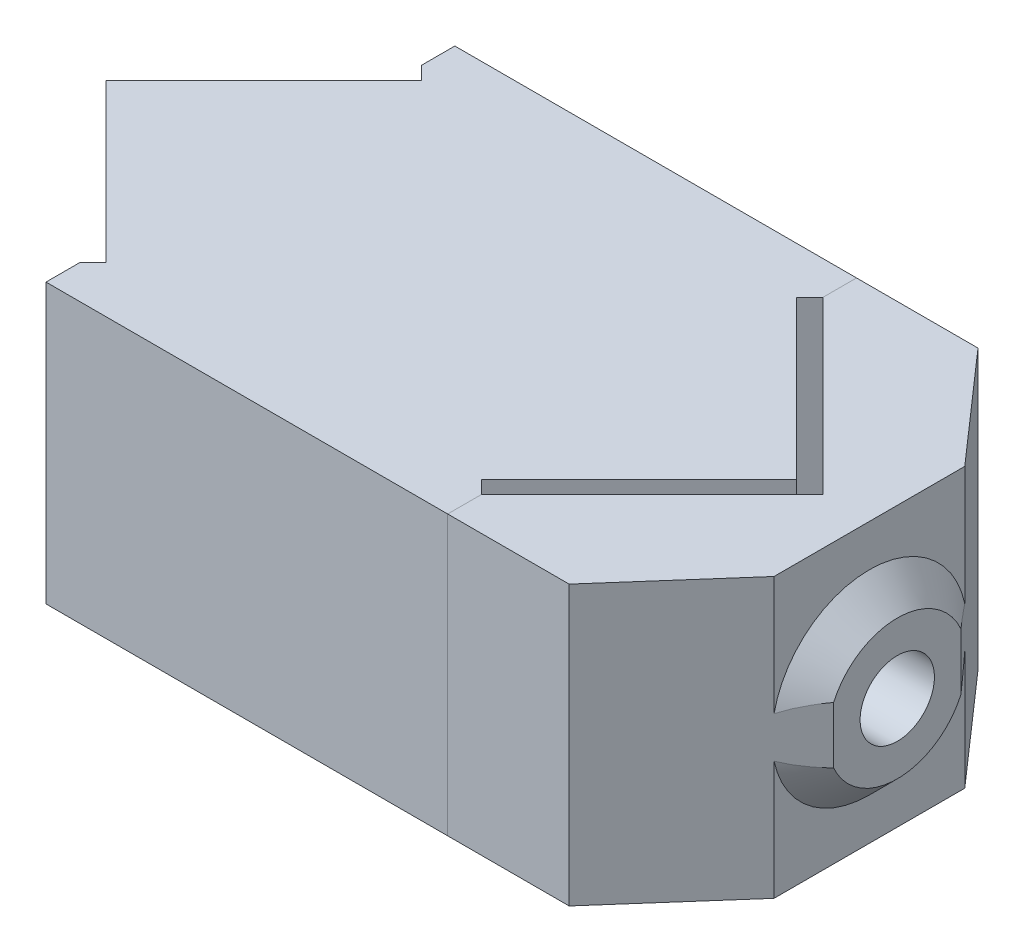
ISO-10303-21;
HEADER;
FILE_DESCRIPTION(('STEP AP214'),'2;1');
FILE_NAME('part.step','',(''),(''),'','','');
FILE_SCHEMA(('AUTOMOTIVE_DESIGN { 1 0 10303 214 1 1 1 1 }'));
ENDSEC;
DATA;
#1=APPLICATION_CONTEXT('core data for automotive mechanical design processes');
#2=APPLICATION_PROTOCOL_DEFINITION('international standard','automotive_design',2000,#1);
#3=PRODUCT_CONTEXT('',#1,'mechanical');
#4=PRODUCT('Part','Part','',(#3));
#5=PRODUCT_RELATED_PRODUCT_CATEGORY('part','',(#4));
#6=PRODUCT_DEFINITION_FORMATION('','',#4);
#7=PRODUCT_DEFINITION_CONTEXT('part definition',#1,'design');
#8=PRODUCT_DEFINITION('design','',#6,#7);
#9=PRODUCT_DEFINITION_SHAPE('','',#8);
#10=(LENGTH_UNIT() NAMED_UNIT(*) SI_UNIT(.MILLI.,.METRE.));
#11=(NAMED_UNIT(*) PLANE_ANGLE_UNIT() SI_UNIT($,.RADIAN.));
#12=(NAMED_UNIT(*) SI_UNIT($,.STERADIAN.) SOLID_ANGLE_UNIT());
#13=UNCERTAINTY_MEASURE_WITH_UNIT(LENGTH_MEASURE(1.E-05),#10,'distance_accuracy_value','');
#14=(GEOMETRIC_REPRESENTATION_CONTEXT(3) GLOBAL_UNCERTAINTY_ASSIGNED_CONTEXT((#13)) GLOBAL_UNIT_ASSIGNED_CONTEXT((#10,
#11,#12)) REPRESENTATION_CONTEXT('',''));
#15=CARTESIAN_POINT('',(0.,0.,0.));
#16=DIRECTION('',(0.,0.,1.));
#17=DIRECTION('',(1.,0.,0.));
#18=AXIS2_PLACEMENT_3D('',#15,#16,#17);
#19=CARTESIAN_POINT('',(48.,0.,0.));
#20=DIRECTION('',(-1.,0.,0.));
#21=DIRECTION('',(0.,0.,1.));
#22=AXIS2_PLACEMENT_3D('',#19,#20,#21);
#23=CONICAL_SURFACE('',#22,7.5,0.785398163397443);
#24=CARTESIAN_POINT('',(48.,0.,0.));
#25=DIRECTION('',(1.,0.,0.));
#26=DIRECTION('',(0.,0.,-1.));
#27=AXIS2_PLACEMENT_3D('',#24,#25,#26);
#28=CIRCLE('',#27,7.5);
#29=CARTESIAN_POINT('',(48.,3.05573928548819,-6.84926692567347));
#30=VERTEX_POINT('',#29);
#31=CARTESIAN_POINT('',(48.,3.05573928548819,6.84926692567347));
#32=VERTEX_POINT('',#31);
#33=EDGE_CURVE('E156',#30,#32,#28,.T.);
#34=ORIENTED_EDGE('',*,*,#33,.F.);
#35=CARTESIAN_POINT('',(48.9987726796251,0.,-5.71261644423293));
#36=DIRECTION('',(-0.751198318711611,0.,0.660076575834083));
#37=DIRECTION('',(-0.660076575834083,0.,-0.751198318711611));
#38=AXIS2_PLACEMENT_3D('',#35,#36,#37);
#39=ELLIPSE('',#38,8.65447533419048,3.10354153061785);
#40=CARTESIAN_POINT('',(45.,2.21640329996971,-10.2634086156541));
#41=VERTEX_POINT('',#40);
#42=EDGE_CURVE('E182',#41,#30,#39,.F.);
#43=ORIENTED_EDGE('',*,*,#42,.F.);
#44=CARTESIAN_POINT('',(45.,0.,0.));
#45=DIRECTION('',(-1.,0.,0.));
#46=DIRECTION('',(0.,0.,1.));
#47=AXIS2_PLACEMENT_3D('',#44,#45,#46);
#48=CIRCLE('',#47,10.5);
#49=CARTESIAN_POINT('',(45.,2.21640329996971,10.2634086156541));
#50=VERTEX_POINT('',#49);
#51=EDGE_CURVE('E174',#50,#41,#48,.T.);
#52=ORIENTED_EDGE('',*,*,#51,.F.);
#53=CARTESIAN_POINT('',(48.9987726796251,0.,5.71261644423293));
#54=DIRECTION('',(-0.751198318711611,0.,-0.660076575834083));
#55=DIRECTION('',(-0.660076575834083,0.,0.751198318711611));
#56=AXIS2_PLACEMENT_3D('',#53,#54,#55);
#57=ELLIPSE('',#56,8.65447533419048,3.10354153061785);
#58=EDGE_CURVE('E186',#32,#50,#57,.F.);
#59=ORIENTED_EDGE('',*,*,#58,.F.);
#60=EDGE_LOOP('',(#34,#43,#52,#59));
#61=FACE_BOUND('',#60,.T.);
#62=ADVANCED_FACE('F51',(#61),#23,.T.);
#63=CARTESIAN_POINT('',(45.,15.,-10.2634086156541));
#64=DIRECTION('',(-1.,0.,0.));
#65=DIRECTION('',(0.,0.,1.));
#66=AXIS2_PLACEMENT_3D('',#63,#64,#65);
#67=PLANE('',#66);
#68=DIRECTION('',(0.,-1.,0.));
#69=VECTOR('',#68,1.);
#70=CARTESIAN_POINT('',(45.,15.,10.2634086156541));
#71=LINE('',#70,#69);
#72=CARTESIAN_POINT('',(45.,15.,10.2634086156541));
#73=VERTEX_POINT('',#72);
#74=EDGE_CURVE('E218',#73,#50,#71,.T.);
#75=ORIENTED_EDGE('',*,*,#74,.T.);
#76=ORIENTED_EDGE('',*,*,#51,.T.);
#77=DIRECTION('',(0.,-1.,0.));
#78=VECTOR('',#77,1.);
#79=CARTESIAN_POINT('',(45.,15.,-10.2634086156541));
#80=LINE('',#79,#78);
#81=CARTESIAN_POINT('',(45.,15.,-10.2634086156541));
#82=VERTEX_POINT('',#81);
#83=EDGE_CURVE('E209',#82,#41,#80,.T.);
#84=ORIENTED_EDGE('',*,*,#83,.F.);
#85=DIRECTION('',(0.,0.,-1.));
#86=VECTOR('',#85,1.);
#87=CARTESIAN_POINT('',(45.,15.,-10.2634086156541));
#88=LINE('',#87,#86);
#89=EDGE_CURVE('E276',#73,#82,#88,.T.);
#90=ORIENTED_EDGE('',*,*,#89,.F.);
#91=EDGE_LOOP('',(#75,#76,#84,#90));
#92=FACE_BOUND('',#91,.T.);
#93=ADVANCED_FACE('F301',(#92),#67,.F.);
#94=CARTESIAN_POINT('',(40.,15.,0.));
#95=DIRECTION('',(0.707106781186544,0.,-0.707106781186551));
#96=DIRECTION('',(-0.707106781186551,0.,-0.707106781186544));
#97=AXIS2_PLACEMENT_3D('',#94,#95,#96);
#98=PLANE('',#97);
#99=DIRECTION('',(0.,-1.,0.));
#100=VECTOR('',#99,1.);
#101=CARTESIAN_POINT('',(40.,15.,0.));
#102=LINE('',#101,#100);
#103=CARTESIAN_POINT('',(40.,-4.,0.));
#104=VERTEX_POINT('',#103);
#105=CARTESIAN_POINT('',(40.,-15.,0.));
#106=VERTEX_POINT('',#105);
#107=EDGE_CURVE('E164',#104,#106,#102,.T.);
#108=ORIENTED_EDGE('',*,*,#107,.F.);
#109=CARTESIAN_POINT('',(40.,0.,0.));
#110=DIRECTION('',(0.707106781186544,0.,-0.707106781186551));
#111=DIRECTION('',(0.707106781186551,0.,0.707106781186544));
#112=AXIS2_PLACEMENT_3D('',#109,#110,#111);
#113=ELLIPSE('',#112,5.65685424949241,4.);
#114=CARTESIAN_POINT('',(40.,4.,0.));
#115=VERTEX_POINT('',#114);
#116=EDGE_CURVE('E152',#104,#115,#113,.T.);
#117=ORIENTED_EDGE('',*,*,#116,.T.);
#118=CARTESIAN_POINT('',(40.,15.,0.));
#119=VERTEX_POINT('',#118);
#120=EDGE_CURVE('E162',#119,#115,#102,.T.);
#121=ORIENTED_EDGE('',*,*,#120,.F.);
#122=DIRECTION('',(0.707106781186551,0.,0.707106781186544));
#123=VECTOR('',#122,1.);
#124=CARTESIAN_POINT('',(40.,15.,0.));
#125=LINE('',#124,#123);
#126=CARTESIAN_POINT('',(21.6152236891497,15.,-18.3847763108501));
#127=VERTEX_POINT('',#126);
#128=EDGE_CURVE('E256',#127,#119,#125,.T.);
#129=ORIENTED_EDGE('',*,*,#128,.F.);
#130=DIRECTION('',(0.,-1.,0.));
#131=VECTOR('',#130,1.);
#132=CARTESIAN_POINT('',(21.6152236891497,15.,-18.3847763108501));
#133=LINE('',#132,#131);
#134=CARTESIAN_POINT('',(21.6152236891497,-15.,-18.3847763108501));
#135=VERTEX_POINT('',#134);
#136=EDGE_CURVE('E257',#127,#135,#133,.T.);
#137=ORIENTED_EDGE('',*,*,#136,.T.);
#138=DIRECTION('',(0.707106781186551,0.,0.707106781186544));
#139=VECTOR('',#138,1.);
#140=CARTESIAN_POINT('',(40.,-15.,0.));
#141=LINE('',#140,#139);
#142=EDGE_CURVE('E165',#135,#106,#141,.T.);
#143=ORIENTED_EDGE('',*,*,#142,.T.);
#144=EDGE_LOOP('',(#108,#117,#121,#129,#137,#143));
#145=FACE_BOUND('',#144,.T.);
#146=ADVANCED_FACE('F160',(#145),#98,.F.);
#147=CARTESIAN_POINT('',(40.,15.,0.));
#148=DIRECTION('',(0.707106781186544,0.,0.707106781186551));
#149=DIRECTION('',(0.707106781186551,0.,-0.707106781186544));
#150=AXIS2_PLACEMENT_3D('',#147,#148,#149);
#151=PLANE('',#150);
#152=ORIENTED_EDGE('',*,*,#120,.T.);
#153=CARTESIAN_POINT('',(40.,0.,0.));
#154=DIRECTION('',(0.707106781186544,0.,0.707106781186551));
#155=DIRECTION('',(0.707106781186551,0.,-0.707106781186544));
#156=AXIS2_PLACEMENT_3D('',#153,#154,#155);
#157=ELLIPSE('',#156,5.65685424949241,4.);
#158=EDGE_CURVE('E148',#115,#104,#157,.T.);
#159=ORIENTED_EDGE('',*,*,#158,.T.);
#160=ORIENTED_EDGE('',*,*,#107,.T.);
#161=DIRECTION('',(-0.707106781186551,0.,0.707106781186544));
#162=VECTOR('',#161,1.);
#163=CARTESIAN_POINT('',(40.,-15.,0.));
#164=LINE('',#163,#162);
#165=CARTESIAN_POINT('',(21.6152236891497,-15.,18.3847763108501));
#166=VERTEX_POINT('',#165);
#167=EDGE_CURVE('E239',#106,#166,#164,.T.);
#168=ORIENTED_EDGE('',*,*,#167,.T.);
#169=DIRECTION('',(0.,-1.,0.));
#170=VECTOR('',#169,1.);
#171=CARTESIAN_POINT('',(21.6152236891497,15.,18.3847763108501));
#172=LINE('',#171,#170);
#173=CARTESIAN_POINT('',(21.6152236891497,15.,18.3847763108501));
#174=VERTEX_POINT('',#173);
#175=EDGE_CURVE('E176',#174,#166,#172,.T.);
#176=ORIENTED_EDGE('',*,*,#175,.F.);
#177=DIRECTION('',(-0.707106781186551,0.,0.707106781186544));
#178=VECTOR('',#177,1.);
#179=CARTESIAN_POINT('',(40.,15.,0.));
#180=LINE('',#179,#178);
#181=EDGE_CURVE('E169',#119,#174,#180,.T.);
#182=ORIENTED_EDGE('',*,*,#181,.F.);
#183=EDGE_LOOP('',(#152,#159,#160,#168,#176,#182));
#184=FACE_BOUND('',#183,.T.);
#185=ADVANCED_FACE('F167',(#184),#151,.F.);
#186=CARTESIAN_POINT('',(21.6152236891497,15.,18.3847763108501));
#187=DIRECTION('',(1.,0.,0.));
#188=DIRECTION('',(0.,0.,-1.));
#189=AXIS2_PLACEMENT_3D('',#186,#187,#188);
#190=PLANE('',#189);
#191=DIRECTION('',(0.,0.,1.));
#192=VECTOR('',#191,1.);
#193=CARTESIAN_POINT('',(21.6152236891497,-15.,18.3847763108501));
#194=LINE('',#193,#192);
#195=CARTESIAN_POINT('',(21.6152236891497,-15.,22.));
#196=VERTEX_POINT('',#195);
#197=EDGE_CURVE('E233',#166,#196,#194,.T.);
#198=ORIENTED_EDGE('',*,*,#197,.T.);
#199=DIRECTION('',(0.,-1.,0.));
#200=VECTOR('',#199,1.);
#201=CARTESIAN_POINT('',(21.6152236891497,15.,22.));
#202=LINE('',#201,#200);
#203=CARTESIAN_POINT('',(21.6152236891497,15.,22.));
#204=VERTEX_POINT('',#203);
#205=EDGE_CURVE('E222',#204,#196,#202,.T.);
#206=ORIENTED_EDGE('',*,*,#205,.F.);
#207=DIRECTION('',(0.,0.,1.));
#208=VECTOR('',#207,1.);
#209=CARTESIAN_POINT('',(21.6152236891497,15.,18.3847763108501));
#210=LINE('',#209,#208);
#211=EDGE_CURVE('E234',#174,#204,#210,.T.);
#212=ORIENTED_EDGE('',*,*,#211,.F.);
#213=ORIENTED_EDGE('',*,*,#175,.T.);
#214=EDGE_LOOP('',(#198,#206,#212,#213));
#215=FACE_BOUND('',#214,.T.);
#216=ADVANCED_FACE('F232',(#215),#190,.F.);
#217=CARTESIAN_POINT('',(21.6152236891497,15.,22.));
#218=DIRECTION('',(0.,0.,-1.));
#219=DIRECTION('',(-1.,0.,0.));
#220=AXIS2_PLACEMENT_3D('',#217,#218,#219);
#221=PLANE('',#220);
#222=DIRECTION('',(1.,0.,0.));
#223=VECTOR('',#222,1.);
#224=CARTESIAN_POINT('',(21.6152236891497,-15.,22.));
#225=LINE('',#224,#223);
#226=CARTESIAN_POINT('',(34.6870788179746,-15.,22.));
#227=VERTEX_POINT('',#226);
#228=EDGE_CURVE('E241',#196,#227,#225,.T.);
#229=ORIENTED_EDGE('',*,*,#228,.T.);
#230=DIRECTION('',(0.,-1.,0.));
#231=VECTOR('',#230,1.);
#232=CARTESIAN_POINT('',(34.6870788179746,15.,22.));
#233=LINE('',#232,#231);
#234=CARTESIAN_POINT('',(34.6870788179746,15.,22.));
#235=VERTEX_POINT('',#234);
#236=EDGE_CURVE('E220',#235,#227,#233,.T.);
#237=ORIENTED_EDGE('',*,*,#236,.F.);
#238=DIRECTION('',(1.,0.,0.));
#239=VECTOR('',#238,1.);
#240=CARTESIAN_POINT('',(21.6152236891497,15.,22.));
#241=LINE('',#240,#239);
#242=EDGE_CURVE('E280',#204,#235,#241,.T.);
#243=ORIENTED_EDGE('',*,*,#242,.F.);
#244=ORIENTED_EDGE('',*,*,#205,.T.);
#245=EDGE_LOOP('',(#229,#237,#243,#244));
#246=FACE_BOUND('',#245,.T.);
#247=ADVANCED_FACE('F370',(#246),#221,.F.);
#248=CARTESIAN_POINT('',(34.6870788179746,15.,22.));
#249=DIRECTION('',(-0.751198318711611,0.,-0.660076575834083));
#250=DIRECTION('',(-0.660076575834083,0.,0.751198318711611));
#251=AXIS2_PLACEMENT_3D('',#248,#249,#250);
#252=PLANE('',#251);
#253=DIRECTION('',(0.,-1.,0.));
#254=VECTOR('',#253,1.);
#255=CARTESIAN_POINT('',(48.,15.,6.84926692567347));
#256=LINE('',#255,#254);
#257=CARTESIAN_POINT('',(48.,-3.05573928548819,6.84926692567347));
#258=VERTEX_POINT('',#257);
#259=EDGE_CURVE('E12',#32,#258,#256,.T.);
#260=ORIENTED_EDGE('',*,*,#259,.F.);
#261=ORIENTED_EDGE('',*,*,#58,.T.);
#262=ORIENTED_EDGE('',*,*,#74,.F.);
#263=DIRECTION('',(0.660076575834083,0.,-0.751198318711611));
#264=VECTOR('',#263,1.);
#265=CARTESIAN_POINT('',(34.6870788179746,15.,22.));
#266=LINE('',#265,#264);
#267=EDGE_CURVE('E278',#235,#73,#266,.T.);
#268=ORIENTED_EDGE('',*,*,#267,.F.);
#269=ORIENTED_EDGE('',*,*,#236,.T.);
#270=DIRECTION('',(0.660076575834083,0.,-0.751198318711611));
#271=VECTOR('',#270,1.);
#272=CARTESIAN_POINT('',(34.6870788179746,-15.,22.));
#273=LINE('',#272,#271);
#274=CARTESIAN_POINT('',(45.,-15.,10.2634086156541));
#275=VERTEX_POINT('',#274);
#276=EDGE_CURVE('E243',#227,#275,#273,.T.);
#277=ORIENTED_EDGE('',*,*,#276,.T.);
#278=CARTESIAN_POINT('',(45.,-2.21640329996971,10.2634086156541));
#279=VERTEX_POINT('',#278);
#280=EDGE_CURVE('E195',#279,#275,#71,.T.);
#281=ORIENTED_EDGE('',*,*,#280,.F.);
#282=EDGE_CURVE('E185',#279,#258,#57,.F.);
#283=ORIENTED_EDGE('',*,*,#282,.T.);
#284=EDGE_LOOP('',(#260,#261,#262,#268,#269,#277,#281,#283));
#285=FACE_BOUND('',#284,.T.);
#286=ADVANCED_FACE('F193',(#285),#252,.F.);
#287=CARTESIAN_POINT('',(45.,-2.21640329996971,-10.2634086156541));
#288=VERTEX_POINT('',#287);
#289=CARTESIAN_POINT('',(45.,-15.,-10.2634086156541));
#290=VERTEX_POINT('',#289);
#291=EDGE_CURVE('E205',#288,#290,#80,.T.);
#292=ORIENTED_EDGE('',*,*,#291,.F.);
#293=CARTESIAN_POINT('',(45.,0.,0.));
#294=DIRECTION('',(-1.,0.,0.));
#295=DIRECTION('',(0.,0.,1.));
#296=AXIS2_PLACEMENT_3D('',#293,#294,#295);
#297=CIRCLE('',#296,10.5);
#298=EDGE_CURVE('E171',#288,#279,#297,.T.);
#299=ORIENTED_EDGE('',*,*,#298,.T.);
#300=ORIENTED_EDGE('',*,*,#280,.T.);
#301=DIRECTION('',(0.,0.,-1.));
#302=VECTOR('',#301,1.);
#303=CARTESIAN_POINT('',(45.,-15.,-10.2634086156541));
#304=LINE('',#303,#302);
#305=EDGE_CURVE('E207',#275,#290,#304,.T.);
#306=ORIENTED_EDGE('',*,*,#305,.T.);
#307=EDGE_LOOP('',(#292,#299,#300,#306));
#308=FACE_BOUND('',#307,.T.);
#309=ADVANCED_FACE('F203',(#308),#67,.F.);
#310=CARTESIAN_POINT('',(34.6870788179746,15.,-22.));
#311=DIRECTION('',(-0.751198318711611,0.,0.660076575834083));
#312=DIRECTION('',(0.660076575834083,0.,0.751198318711611));
#313=AXIS2_PLACEMENT_3D('',#310,#311,#312);
#314=PLANE('',#313);
#315=DIRECTION('',(0.,1.,0.));
#316=VECTOR('',#315,1.);
#317=CARTESIAN_POINT('',(48.,15.,-6.84926692567347));
#318=LINE('',#317,#316);
#319=CARTESIAN_POINT('',(48.,-3.05573928548819,-6.84926692567347));
#320=VERTEX_POINT('',#319);
#321=EDGE_CURVE('E60',#320,#30,#318,.T.);
#322=ORIENTED_EDGE('',*,*,#321,.F.);
#323=EDGE_CURVE('E183',#320,#288,#39,.F.);
#324=ORIENTED_EDGE('',*,*,#323,.T.);
#325=ORIENTED_EDGE('',*,*,#291,.T.);
#326=DIRECTION('',(-0.660076575834083,0.,-0.751198318711611));
#327=VECTOR('',#326,1.);
#328=CARTESIAN_POINT('',(34.6870788179746,-15.,-22.));
#329=LINE('',#328,#327);
#330=CARTESIAN_POINT('',(34.6870788179746,-15.,-22.));
#331=VERTEX_POINT('',#330);
#332=EDGE_CURVE('E250',#290,#331,#329,.T.);
#333=ORIENTED_EDGE('',*,*,#332,.T.);
#334=DIRECTION('',(0.,-1.,0.));
#335=VECTOR('',#334,1.);
#336=CARTESIAN_POINT('',(34.6870788179746,15.,-22.));
#337=LINE('',#336,#335);
#338=CARTESIAN_POINT('',(34.6870788179746,15.,-22.));
#339=VERTEX_POINT('',#338);
#340=EDGE_CURVE('E210',#339,#331,#337,.T.);
#341=ORIENTED_EDGE('',*,*,#340,.F.);
#342=DIRECTION('',(-0.660076575834083,0.,-0.751198318711611));
#343=VECTOR('',#342,1.);
#344=CARTESIAN_POINT('',(34.6870788179746,15.,-22.));
#345=LINE('',#344,#343);
#346=EDGE_CURVE('E274',#82,#339,#345,.T.);
#347=ORIENTED_EDGE('',*,*,#346,.F.);
#348=ORIENTED_EDGE('',*,*,#83,.T.);
#349=ORIENTED_EDGE('',*,*,#42,.T.);
#350=EDGE_LOOP('',(#322,#324,#325,#333,#341,#347,#348,#349));
#351=FACE_BOUND('',#350,.T.);
#352=ADVANCED_FACE('F291',(#351),#314,.F.);
#353=CARTESIAN_POINT('',(21.6152236891497,15.,-22.));
#354=DIRECTION('',(0.,0.,1.));
#355=DIRECTION('',(1.,0.,0.));
#356=AXIS2_PLACEMENT_3D('',#353,#354,#355);
#357=PLANE('',#356);
#358=DIRECTION('',(-1.,0.,0.));
#359=VECTOR('',#358,1.);
#360=CARTESIAN_POINT('',(21.6152236891497,-15.,-22.));
#361=LINE('',#360,#359);
#362=CARTESIAN_POINT('',(21.6152236891497,-15.,-22.));
#363=VERTEX_POINT('',#362);
#364=EDGE_CURVE('E252',#331,#363,#361,.T.);
#365=ORIENTED_EDGE('',*,*,#364,.T.);
#366=DIRECTION('',(0.,-1.,0.));
#367=VECTOR('',#366,1.);
#368=CARTESIAN_POINT('',(21.6152236891497,15.,-22.));
#369=LINE('',#368,#367);
#370=CARTESIAN_POINT('',(21.6152236891497,15.,-22.));
#371=VERTEX_POINT('',#370);
#372=EDGE_CURVE('E214',#371,#363,#369,.T.);
#373=ORIENTED_EDGE('',*,*,#372,.F.);
#374=DIRECTION('',(-1.,0.,0.));
#375=VECTOR('',#374,1.);
#376=CARTESIAN_POINT('',(21.6152236891497,15.,-22.));
#377=LINE('',#376,#375);
#378=EDGE_CURVE('E272',#339,#371,#377,.T.);
#379=ORIENTED_EDGE('',*,*,#378,.F.);
#380=ORIENTED_EDGE('',*,*,#340,.T.);
#381=EDGE_LOOP('',(#365,#373,#379,#380));
#382=FACE_BOUND('',#381,.T.);
#383=ADVANCED_FACE('F293',(#382),#357,.F.);
#384=CARTESIAN_POINT('',(21.6152236891497,15.,-18.3847763108501));
#385=DIRECTION('',(1.,0.,0.));
#386=DIRECTION('',(0.,0.,-1.));
#387=AXIS2_PLACEMENT_3D('',#384,#385,#386);
#388=PLANE('',#387);
#389=DIRECTION('',(0.,0.,1.));
#390=VECTOR('',#389,1.);
#391=CARTESIAN_POINT('',(21.6152236891497,-15.,-18.3847763108501));
#392=LINE('',#391,#390);
#393=EDGE_CURVE('E254',#363,#135,#392,.T.);
#394=ORIENTED_EDGE('',*,*,#393,.T.);
#395=ORIENTED_EDGE('',*,*,#136,.F.);
#396=DIRECTION('',(0.,0.,1.));
#397=VECTOR('',#396,1.);
#398=CARTESIAN_POINT('',(21.6152236891497,15.,-18.3847763108501));
#399=LINE('',#398,#397);
#400=EDGE_CURVE('E259',#371,#127,#399,.T.);
#401=ORIENTED_EDGE('',*,*,#400,.F.);
#402=ORIENTED_EDGE('',*,*,#372,.T.);
#403=EDGE_LOOP('',(#394,#395,#401,#402));
#404=FACE_BOUND('',#403,.T.);
#405=ADVANCED_FACE('F265',(#404),#388,.F.);
#406=CARTESIAN_POINT('',(0.,15.,0.));
#407=DIRECTION('',(0.,1.,0.));
#408=DIRECTION('',(0.,0.,1.));
#409=AXIS2_PLACEMENT_3D('',#406,#407,#408);
#410=PLANE('',#409);
#411=ORIENTED_EDGE('',*,*,#128,.T.);
#412=ORIENTED_EDGE('',*,*,#181,.T.);
#413=ORIENTED_EDGE('',*,*,#211,.T.);
#414=ORIENTED_EDGE('',*,*,#242,.T.);
#415=ORIENTED_EDGE('',*,*,#267,.T.);
#416=ORIENTED_EDGE('',*,*,#89,.T.);
#417=ORIENTED_EDGE('',*,*,#346,.T.);
#418=ORIENTED_EDGE('',*,*,#378,.T.);
#419=ORIENTED_EDGE('',*,*,#400,.T.);
#420=EDGE_LOOP('',(#411,#412,#413,#414,#415,#416,#417,#418,#419));
#421=FACE_BOUND('',#420,.T.);
#422=ADVANCED_FACE('F319',(#421),#410,.T.);
#423=CARTESIAN_POINT('',(0.,-15.,0.));
#424=DIRECTION('',(0.,1.,0.));
#425=DIRECTION('',(0.,0.,1.));
#426=AXIS2_PLACEMENT_3D('',#423,#424,#425);
#427=PLANE('',#426);
#428=ORIENTED_EDGE('',*,*,#142,.F.);
#429=ORIENTED_EDGE('',*,*,#393,.F.);
#430=ORIENTED_EDGE('',*,*,#364,.F.);
#431=ORIENTED_EDGE('',*,*,#332,.F.);
#432=ORIENTED_EDGE('',*,*,#305,.F.);
#433=ORIENTED_EDGE('',*,*,#276,.F.);
#434=ORIENTED_EDGE('',*,*,#228,.F.);
#435=ORIENTED_EDGE('',*,*,#197,.F.);
#436=ORIENTED_EDGE('',*,*,#167,.F.);
#437=EDGE_LOOP('',(#428,#429,#430,#431,#432,#433,#434,#435,#436));
#438=FACE_BOUND('',#437,.T.);
#439=ADVANCED_FACE('F238',(#438),#427,.F.);
#440=CARTESIAN_POINT('',(-37.1715728752538,0.,0.));
#441=DIRECTION('',(1.,0.,0.));
#442=DIRECTION('',(0.,0.,-1.));
#443=AXIS2_PLACEMENT_3D('',#440,#441,#442);
#444=CYLINDRICAL_SURFACE('',#443,4.);
#445=ORIENTED_EDGE('',*,*,#158,.F.);
#446=ORIENTED_EDGE('',*,*,#116,.F.);
#447=EDGE_LOOP('',(#445,#446));
#448=FACE_BOUND('',#447,.T.);
#449=CARTESIAN_POINT('',(48.,0.,0.));
#450=DIRECTION('',(1.,0.,0.));
#451=DIRECTION('',(0.,0.,-1.));
#452=AXIS2_PLACEMENT_3D('',#449,#450,#451);
#453=CIRCLE('',#452,4.);
#454=CARTESIAN_POINT('',(48.,0.,-4.));
#455=VERTEX_POINT('',#454);
#456=EDGE_CURVE('E286',#455,#455,#453,.T.);
#457=ORIENTED_EDGE('',*,*,#456,.T.);
#458=EDGE_LOOP('',(#457));
#459=FACE_BOUND('',#458,.T.);
#460=ADVANCED_FACE('F150',(#448,#459),#444,.F.);
#461=CARTESIAN_POINT('',(48.,0.,0.));
#462=DIRECTION('',(1.,0.,0.));
#463=DIRECTION('',(0.,0.,-1.));
#464=AXIS2_PLACEMENT_3D('',#461,#462,#463);
#465=PLANE('',#464);
#466=ORIENTED_EDGE('',*,*,#33,.T.);
#467=ORIENTED_EDGE('',*,*,#259,.T.);
#468=EDGE_CURVE('E200',#258,#320,#28,.T.);
#469=ORIENTED_EDGE('',*,*,#468,.T.);
#470=ORIENTED_EDGE('',*,*,#321,.T.);
#471=EDGE_LOOP('',(#466,#467,#469,#470));
#472=FACE_BOUND('',#471,.T.);
#473=ORIENTED_EDGE('',*,*,#456,.F.);
#474=EDGE_LOOP('',(#473));
#475=FACE_BOUND('',#474,.T.);
#476=ADVANCED_FACE('F289',(#472,#475),#465,.T.);
#477=ORIENTED_EDGE('',*,*,#323,.F.);
#478=ORIENTED_EDGE('',*,*,#468,.F.);
#479=ORIENTED_EDGE('',*,*,#282,.F.);
#480=ORIENTED_EDGE('',*,*,#298,.F.);
#481=EDGE_LOOP('',(#477,#478,#479,#480));
#482=FACE_BOUND('',#481,.T.);
#483=ADVANCED_FACE('F54',(#482),#23,.T.);
#484=CLOSED_SHELL('',(#62,#93,#146,#185,#216,#247,#286,#309,#352,#383,#405,#422,#439,#460,#476,#483));
#485=MANIFOLD_SOLID_BREP('B2',#484);
#486=CARTESIAN_POINT('',(37.1715728752538,15.,0.));
#487=DIRECTION('',(-0.707106781186544,0.,-0.707106781186551));
#488=DIRECTION('',(-0.707106781186551,0.,0.707106781186544));
#489=AXIS2_PLACEMENT_3D('',#486,#487,#488);
#490=PLANE('',#489);
#491=DIRECTION('',(0.,-1.,0.));
#492=VECTOR('',#491,1.);
#493=CARTESIAN_POINT('',(37.1715728752538,15.,0.));
#494=LINE('',#493,#492);
#495=CARTESIAN_POINT('',(37.1715728752538,-4.,0.));
#496=VERTEX_POINT('',#495);
#497=CARTESIAN_POINT('',(37.1715728752538,-15.,0.));
#498=VERTEX_POINT('',#497);
#499=EDGE_CURVE('E586',#496,#498,#494,.T.);
#500=ORIENTED_EDGE('',*,*,#499,.F.);
#501=CARTESIAN_POINT('',(37.1715728752538,0.,0.));
#502=DIRECTION('',(-0.707106781186544,0.,-0.707106781186551));
#503=DIRECTION('',(0.707106781186551,0.,-0.707106781186544));
#504=AXIS2_PLACEMENT_3D('',#501,#502,#503);
#505=ELLIPSE('',#504,5.65685424949241,4.);
#506=CARTESIAN_POINT('',(37.1715728752538,4.,0.));
#507=VERTEX_POINT('',#506);
#508=EDGE_CURVE('E452',#496,#507,#505,.T.);
#509=ORIENTED_EDGE('',*,*,#508,.T.);
#510=CARTESIAN_POINT('',(37.1715728752538,15.,0.));
#511=VERTEX_POINT('',#510);
#512=EDGE_CURVE('E446',#511,#507,#494,.T.);
#513=ORIENTED_EDGE('',*,*,#512,.F.);
#514=DIRECTION('',(0.707106781186551,0.,-0.707106781186544));
#515=VECTOR('',#514,1.);
#516=CARTESIAN_POINT('',(37.1715728752538,15.,0.));
#517=LINE('',#516,#515);
#518=CARTESIAN_POINT('',(20.2010101267766,15.,16.970562748477));
#519=VERTEX_POINT('',#518);
#520=EDGE_CURVE('E641',#519,#511,#517,.T.);
#521=ORIENTED_EDGE('',*,*,#520,.F.);
#522=DIRECTION('',(0.,-1.,0.));
#523=VECTOR('',#522,1.);
#524=CARTESIAN_POINT('',(20.2010101267766,15.,16.970562748477));
#525=LINE('',#524,#523);
#526=CARTESIAN_POINT('',(20.2010101267766,-15.,16.970562748477));
#527=VERTEX_POINT('',#526);
#528=EDGE_CURVE('E609',#519,#527,#525,.T.);
#529=ORIENTED_EDGE('',*,*,#528,.T.);
#530=DIRECTION('',(0.707106781186551,0.,-0.707106781186544));
#531=VECTOR('',#530,1.);
#532=CARTESIAN_POINT('',(37.1715728752538,-15.,0.));
#533=LINE('',#532,#531);
#534=EDGE_CURVE('E602',#527,#498,#533,.T.);
#535=ORIENTED_EDGE('',*,*,#534,.T.);
#536=EDGE_LOOP('',(#500,#509,#513,#521,#529,#535));
#537=FACE_BOUND('',#536,.T.);
#538=ADVANCED_FACE('F439',(#537),#490,.F.);
#539=CARTESIAN_POINT('',(37.1715728752538,15.,0.));
#540=DIRECTION('',(-0.707106781186544,0.,0.707106781186551));
#541=DIRECTION('',(0.707106781186551,0.,0.707106781186544));
#542=AXIS2_PLACEMENT_3D('',#539,#540,#541);
#543=PLANE('',#542);
#544=ORIENTED_EDGE('',*,*,#512,.T.);
#545=CARTESIAN_POINT('',(37.1715728752538,0.,0.));
#546=DIRECTION('',(-0.707106781186544,0.,0.707106781186551));
#547=DIRECTION('',(0.707106781186551,0.,0.707106781186544));
#548=AXIS2_PLACEMENT_3D('',#545,#546,#547);
#549=ELLIPSE('',#548,5.65685424949241,4.);
#550=EDGE_CURVE('E559',#507,#496,#549,.T.);
#551=ORIENTED_EDGE('',*,*,#550,.T.);
#552=ORIENTED_EDGE('',*,*,#499,.T.);
#553=DIRECTION('',(-0.707106781186551,0.,-0.707106781186544));
#554=VECTOR('',#553,1.);
#555=CARTESIAN_POINT('',(37.1715728752538,-15.,0.));
#556=LINE('',#555,#554);
#557=CARTESIAN_POINT('',(20.2010101267766,-15.,-16.970562748477));
#558=VERTEX_POINT('',#557);
#559=EDGE_CURVE('E594',#498,#558,#556,.T.);
#560=ORIENTED_EDGE('',*,*,#559,.T.);
#561=DIRECTION('',(0.,-1.,0.));
#562=VECTOR('',#561,1.);
#563=CARTESIAN_POINT('',(20.2010101267766,15.,-16.970562748477));
#564=LINE('',#563,#562);
#565=CARTESIAN_POINT('',(20.2010101267766,15.,-16.970562748477));
#566=VERTEX_POINT('',#565);
#567=EDGE_CURVE('E584',#566,#558,#564,.T.);
#568=ORIENTED_EDGE('',*,*,#567,.F.);
#569=DIRECTION('',(-0.707106781186551,0.,-0.707106781186544));
#570=VECTOR('',#569,1.);
#571=CARTESIAN_POINT('',(37.1715728752538,15.,0.));
#572=LINE('',#571,#570);
#573=EDGE_CURVE('E694',#511,#566,#572,.T.);
#574=ORIENTED_EDGE('',*,*,#573,.F.);
#575=EDGE_LOOP('',(#544,#551,#552,#560,#568,#574));
#576=FACE_BOUND('',#575,.T.);
#577=ADVANCED_FACE('F592',(#576),#543,.F.);
#578=CARTESIAN_POINT('',(20.2010101267766,15.,-16.970562748477));
#579=DIRECTION('',(-0.707106781186551,0.,-0.707106781186544));
#580=DIRECTION('',(-0.707106781186544,0.,0.707106781186551));
#581=AXIS2_PLACEMENT_3D('',#578,#579,#580);
#582=PLANE('',#581);
#583=DIRECTION('',(0.707106781186544,0.,-0.707106781186551));
#584=VECTOR('',#583,1.);
#585=CARTESIAN_POINT('',(20.2010101267766,-15.,-16.970562748477));
#586=LINE('',#585,#584);
#587=CARTESIAN_POINT('',(21.6152236891497,-15.,-18.3847763108501));
#588=VERTEX_POINT('',#587);
#589=EDGE_CURVE('E604',#558,#588,#586,.T.);
#590=ORIENTED_EDGE('',*,*,#589,.T.);
#591=DIRECTION('',(0.,-1.,0.));
#592=VECTOR('',#591,1.);
#593=CARTESIAN_POINT('',(21.6152236891497,15.,-18.3847763108501));
#594=LINE('',#593,#592);
#595=CARTESIAN_POINT('',(21.6152236891497,15.,-18.3847763108501));
#596=VERTEX_POINT('',#595);
#597=EDGE_CURVE('E581',#596,#588,#594,.T.);
#598=ORIENTED_EDGE('',*,*,#597,.F.);
#599=DIRECTION('',(0.707106781186544,0.,-0.707106781186551));
#600=VECTOR('',#599,1.);
#601=CARTESIAN_POINT('',(20.2010101267766,15.,-16.970562748477));
#602=LINE('',#601,#600);
#603=EDGE_CURVE('E692',#566,#596,#602,.T.);
#604=ORIENTED_EDGE('',*,*,#603,.F.);
#605=ORIENTED_EDGE('',*,*,#567,.T.);
#606=EDGE_LOOP('',(#590,#598,#604,#605));
#607=FACE_BOUND('',#606,.T.);
#608=ADVANCED_FACE('F717',(#607),#582,.F.);
#609=CARTESIAN_POINT('',(21.6152236891497,15.,-18.3847763108501));
#610=DIRECTION('',(-1.,0.,0.));
#611=DIRECTION('',(0.,0.,1.));
#612=AXIS2_PLACEMENT_3D('',#609,#610,#611);
#613=PLANE('',#612);
#614=DIRECTION('',(0.,0.,-1.));
#615=VECTOR('',#614,1.);
#616=CARTESIAN_POINT('',(21.6152236891497,-15.,-18.3847763108501));
#617=LINE('',#616,#615);
#618=CARTESIAN_POINT('',(21.6152236891497,-15.,-22.));
#619=VERTEX_POINT('',#618);
#620=EDGE_CURVE('E617',#588,#619,#617,.T.);
#621=ORIENTED_EDGE('',*,*,#620,.T.);
#622=DIRECTION('',(0.,-1.,0.));
#623=VECTOR('',#622,1.);
#624=CARTESIAN_POINT('',(21.6152236891497,15.,-22.));
#625=LINE('',#624,#623);
#626=CARTESIAN_POINT('',(21.6152236891497,15.,-22.));
#627=VERTEX_POINT('',#626);
#628=EDGE_CURVE('E578',#627,#619,#625,.T.);
#629=ORIENTED_EDGE('',*,*,#628,.F.);
#630=DIRECTION('',(0.,0.,-1.));
#631=VECTOR('',#630,1.);
#632=CARTESIAN_POINT('',(21.6152236891497,15.,-18.3847763108501));
#633=LINE('',#632,#631);
#634=EDGE_CURVE('E690',#596,#627,#633,.T.);
#635=ORIENTED_EDGE('',*,*,#634,.F.);
#636=ORIENTED_EDGE('',*,*,#597,.T.);
#637=EDGE_LOOP('',(#621,#629,#635,#636));
#638=FACE_BOUND('',#637,.T.);
#639=ADVANCED_FACE('F721',(#638),#613,.F.);
#640=CARTESIAN_POINT('',(-21.6152236891497,15.,-22.));
#641=DIRECTION('',(0.,0.,1.));
#642=DIRECTION('',(1.,0.,0.));
#643=AXIS2_PLACEMENT_3D('',#640,#641,#642);
#644=PLANE('',#643);
#645=DIRECTION('',(-1.,0.,0.));
#646=VECTOR('',#645,1.);
#647=CARTESIAN_POINT('',(-21.6152236891497,-15.,-22.));
#648=LINE('',#647,#646);
#649=CARTESIAN_POINT('',(-21.6152236891497,-15.,-22.));
#650=VERTEX_POINT('',#649);
#651=EDGE_CURVE('E620',#619,#650,#648,.T.);
#652=ORIENTED_EDGE('',*,*,#651,.T.);
#653=DIRECTION('',(0.,-1.,0.));
#654=VECTOR('',#653,1.);
#655=CARTESIAN_POINT('',(-21.6152236891497,15.,-22.));
#656=LINE('',#655,#654);
#657=CARTESIAN_POINT('',(-21.6152236891497,15.,-22.));
#658=VERTEX_POINT('',#657);
#659=EDGE_CURVE('E575',#658,#650,#656,.T.);
#660=ORIENTED_EDGE('',*,*,#659,.F.);
#661=DIRECTION('',(-1.,0.,0.));
#662=VECTOR('',#661,1.);
#663=CARTESIAN_POINT('',(21.6152236891497,15.,-22.));
#664=LINE('',#663,#662);
#665=EDGE_CURVE('E688',#627,#658,#664,.T.);
#666=ORIENTED_EDGE('',*,*,#665,.F.);
#667=ORIENTED_EDGE('',*,*,#628,.T.);
#668=EDGE_LOOP('',(#652,#660,#666,#667));
#669=FACE_BOUND('',#668,.T.);
#670=ADVANCED_FACE('F727',(#669),#644,.F.);
#671=CARTESIAN_POINT('',(-21.6152236891497,15.,-18.3847763108501));
#672=DIRECTION('',(1.,0.,0.));
#673=DIRECTION('',(0.,0.,-1.));
#674=AXIS2_PLACEMENT_3D('',#671,#672,#673);
#675=PLANE('',#674);
#676=DIRECTION('',(0.,0.,1.));
#677=VECTOR('',#676,1.);
#678=CARTESIAN_POINT('',(-21.6152236891497,-15.,-18.3847763108501));
#679=LINE('',#678,#677);
#680=CARTESIAN_POINT('',(-21.6152236891497,-15.,-18.3847763108501));
#681=VERTEX_POINT('',#680);
#682=EDGE_CURVE('E622',#650,#681,#679,.T.);
#683=ORIENTED_EDGE('',*,*,#682,.T.);
#684=DIRECTION('',(0.,-1.,0.));
#685=VECTOR('',#684,1.);
#686=CARTESIAN_POINT('',(-21.6152236891497,15.,-18.3847763108501));
#687=LINE('',#686,#685);
#688=CARTESIAN_POINT('',(-21.6152236891497,15.,-18.3847763108501));
#689=VERTEX_POINT('',#688);
#690=EDGE_CURVE('E567',#689,#681,#687,.T.);
#691=ORIENTED_EDGE('',*,*,#690,.F.);
#692=DIRECTION('',(0.,0.,1.));
#693=VECTOR('',#692,1.);
#694=CARTESIAN_POINT('',(-21.6152236891497,15.,-18.3847763108501));
#695=LINE('',#694,#693);
#696=EDGE_CURVE('E686',#658,#689,#695,.T.);
#697=ORIENTED_EDGE('',*,*,#696,.F.);
#698=ORIENTED_EDGE('',*,*,#659,.T.);
#699=EDGE_LOOP('',(#683,#691,#697,#698));
#700=FACE_BOUND('',#699,.T.);
#701=ADVANCED_FACE('F731',(#700),#675,.F.);
#702=CARTESIAN_POINT('',(-20.2010101267766,15.,-16.970562748477));
#703=DIRECTION('',(0.707106781186551,0.,-0.707106781186544));
#704=DIRECTION('',(-0.707106781186544,0.,-0.707106781186551));
#705=AXIS2_PLACEMENT_3D('',#702,#703,#704);
#706=PLANE('',#705);
#707=DIRECTION('',(0.707106781186544,0.,0.707106781186551));
#708=VECTOR('',#707,1.);
#709=CARTESIAN_POINT('',(-20.2010101267766,-15.,-16.970562748477));
#710=LINE('',#709,#708);
#711=CARTESIAN_POINT('',(-20.2010101267766,-15.,-16.970562748477));
#712=VERTEX_POINT('',#711);
#713=EDGE_CURVE('E624',#681,#712,#710,.T.);
#714=ORIENTED_EDGE('',*,*,#713,.T.);
#715=DIRECTION('',(0.,-1.,0.));
#716=VECTOR('',#715,1.);
#717=CARTESIAN_POINT('',(-20.2010101267766,15.,-16.970562748477));
#718=LINE('',#717,#716);
#719=CARTESIAN_POINT('',(-20.2010101267766,15.,-16.970562748477));
#720=VERTEX_POINT('',#719);
#721=EDGE_CURVE('E564',#720,#712,#718,.T.);
#722=ORIENTED_EDGE('',*,*,#721,.F.);
#723=DIRECTION('',(0.707106781186544,0.,0.707106781186551));
#724=VECTOR('',#723,1.);
#725=CARTESIAN_POINT('',(-20.2010101267766,15.,-16.970562748477));
#726=LINE('',#725,#724);
#727=EDGE_CURVE('E684',#689,#720,#726,.T.);
#728=ORIENTED_EDGE('',*,*,#727,.F.);
#729=ORIENTED_EDGE('',*,*,#690,.T.);
#730=EDGE_LOOP('',(#714,#722,#728,#729));
#731=FACE_BOUND('',#730,.T.);
#732=ADVANCED_FACE('F735',(#731),#706,.F.);
#733=CARTESIAN_POINT('',(-37.1715728752538,15.,0.));
#734=DIRECTION('',(0.707106781186544,0.,0.707106781186551));
#735=DIRECTION('',(0.707106781186551,0.,-0.707106781186544));
#736=AXIS2_PLACEMENT_3D('',#733,#734,#735);
#737=PLANE('',#736);
#738=DIRECTION('',(0.,-1.,0.));
#739=VECTOR('',#738,1.);
#740=CARTESIAN_POINT('',(-37.1715728752538,15.,0.));
#741=LINE('',#740,#739);
#742=CARTESIAN_POINT('',(-37.1715728752538,-4.,0.));
#743=VERTEX_POINT('',#742);
#744=CARTESIAN_POINT('',(-37.1715728752538,-15.,0.));
#745=VERTEX_POINT('',#744);
#746=EDGE_CURVE('E558',#743,#745,#741,.T.);
#747=ORIENTED_EDGE('',*,*,#746,.F.);
#748=CARTESIAN_POINT('',(-37.1715728752538,0.,0.));
#749=DIRECTION('',(0.707106781186544,0.,0.707106781186551));
#750=DIRECTION('',(0.707106781186551,0.,-0.707106781186544));
#751=AXIS2_PLACEMENT_3D('',#748,#749,#750);
#752=ELLIPSE('',#751,5.65685424949241,4.);
#753=CARTESIAN_POINT('',(-37.1715728752538,4.,0.));
#754=VERTEX_POINT('',#753);
#755=EDGE_CURVE('E459',#743,#754,#752,.T.);
#756=ORIENTED_EDGE('',*,*,#755,.T.);
#757=CARTESIAN_POINT('',(-37.1715728752538,15.,0.));
#758=VERTEX_POINT('',#757);
#759=EDGE_CURVE('E555',#758,#754,#741,.T.);
#760=ORIENTED_EDGE('',*,*,#759,.F.);
#761=DIRECTION('',(-0.707106781186551,0.,0.707106781186544));
#762=VECTOR('',#761,1.);
#763=CARTESIAN_POINT('',(-37.1715728752538,15.,0.));
#764=LINE('',#763,#762);
#765=EDGE_CURVE('E682',#720,#758,#764,.T.);
#766=ORIENTED_EDGE('',*,*,#765,.F.);
#767=ORIENTED_EDGE('',*,*,#721,.T.);
#768=DIRECTION('',(-0.707106781186551,0.,0.707106781186544));
#769=VECTOR('',#768,1.);
#770=CARTESIAN_POINT('',(-37.1715728752538,-15.,0.));
#771=LINE('',#770,#769);
#772=EDGE_CURVE('E626',#712,#745,#771,.T.);
#773=ORIENTED_EDGE('',*,*,#772,.T.);
#774=EDGE_LOOP('',(#747,#756,#760,#766,#767,#773));
#775=FACE_BOUND('',#774,.T.);
#776=ADVANCED_FACE('F553',(#775),#737,.F.);
#777=CARTESIAN_POINT('',(-37.1715728752538,15.,0.));
#778=DIRECTION('',(0.707106781186544,0.,-0.707106781186551));
#779=DIRECTION('',(-0.707106781186551,0.,-0.707106781186544));
#780=AXIS2_PLACEMENT_3D('',#777,#778,#779);
#781=PLANE('',#780);
#782=ORIENTED_EDGE('',*,*,#759,.T.);
#783=CARTESIAN_POINT('',(-37.1715728752538,0.,0.));
#784=DIRECTION('',(0.707106781186544,0.,-0.707106781186551));
#785=DIRECTION('',(0.707106781186551,0.,0.707106781186544));
#786=AXIS2_PLACEMENT_3D('',#783,#784,#785);
#787=ELLIPSE('',#786,5.65685424949241,4.);
#788=EDGE_CURVE('E49',#754,#743,#787,.T.);
#789=ORIENTED_EDGE('',*,*,#788,.T.);
#790=ORIENTED_EDGE('',*,*,#746,.T.);
#791=DIRECTION('',(0.707106781186551,0.,0.707106781186544));
#792=VECTOR('',#791,1.);
#793=CARTESIAN_POINT('',(-37.1715728752538,-15.,0.));
#794=LINE('',#793,#792);
#795=CARTESIAN_POINT('',(-20.2010101267766,-15.,16.970562748477));
#796=VERTEX_POINT('',#795);
#797=EDGE_CURVE('E628',#745,#796,#794,.T.);
#798=ORIENTED_EDGE('',*,*,#797,.T.);
#799=DIRECTION('',(0.,-1.,0.));
#800=VECTOR('',#799,1.);
#801=CARTESIAN_POINT('',(-20.2010101267766,15.,16.970562748477));
#802=LINE('',#801,#800);
#803=CARTESIAN_POINT('',(-20.2010101267766,15.,16.970562748477));
#804=VERTEX_POINT('',#803);
#805=EDGE_CURVE('E569',#804,#796,#802,.T.);
#806=ORIENTED_EDGE('',*,*,#805,.F.);
#807=DIRECTION('',(0.707106781186551,0.,0.707106781186544));
#808=VECTOR('',#807,1.);
#809=CARTESIAN_POINT('',(-37.1715728752538,15.,0.));
#810=LINE('',#809,#808);
#811=EDGE_CURVE('E563',#758,#804,#810,.T.);
#812=ORIENTED_EDGE('',*,*,#811,.F.);
#813=EDGE_LOOP('',(#782,#789,#790,#798,#806,#812));
#814=FACE_BOUND('',#813,.T.);
#815=ADVANCED_FACE('F561',(#814),#781,.F.);
#816=CARTESIAN_POINT('',(-20.2010101267766,15.,16.970562748477));
#817=DIRECTION('',(0.707106781186551,0.,0.707106781186544));
#818=DIRECTION('',(0.707106781186544,0.,-0.707106781186551));
#819=AXIS2_PLACEMENT_3D('',#816,#817,#818);
#820=PLANE('',#819);
#821=DIRECTION('',(-0.707106781186544,0.,0.707106781186551));
#822=VECTOR('',#821,1.);
#823=CARTESIAN_POINT('',(-20.2010101267766,-15.,16.970562748477));
#824=LINE('',#823,#822);
#825=CARTESIAN_POINT('',(-21.6152236891497,-15.,18.3847763108501));
#826=VERTEX_POINT('',#825);
#827=EDGE_CURVE('E630',#796,#826,#824,.T.);
#828=ORIENTED_EDGE('',*,*,#827,.T.);
#829=DIRECTION('',(0.,-1.,0.));
#830=VECTOR('',#829,1.);
#831=CARTESIAN_POINT('',(-21.6152236891497,15.,18.3847763108501));
#832=LINE('',#831,#830);
#833=CARTESIAN_POINT('',(-21.6152236891497,15.,18.3847763108501));
#834=VERTEX_POINT('',#833);
#835=EDGE_CURVE('E651',#834,#826,#832,.T.);
#836=ORIENTED_EDGE('',*,*,#835,.F.);
#837=DIRECTION('',(-0.707106781186544,0.,0.707106781186551));
#838=VECTOR('',#837,1.);
#839=CARTESIAN_POINT('',(-20.2010101267766,15.,16.970562748477));
#840=LINE('',#839,#838);
#841=EDGE_CURVE('E662',#804,#834,#840,.T.);
#842=ORIENTED_EDGE('',*,*,#841,.F.);
#843=ORIENTED_EDGE('',*,*,#805,.T.);
#844=EDGE_LOOP('',(#828,#836,#842,#843));
#845=FACE_BOUND('',#844,.T.);
#846=ADVANCED_FACE('F661',(#845),#820,.F.);
#847=CARTESIAN_POINT('',(-21.6152236891497,15.,18.3847763108501));
#848=DIRECTION('',(1.,0.,0.));
#849=DIRECTION('',(0.,0.,-1.));
#850=AXIS2_PLACEMENT_3D('',#847,#848,#849);
#851=PLANE('',#850);
#852=DIRECTION('',(0.,0.,1.));
#853=VECTOR('',#852,1.);
#854=CARTESIAN_POINT('',(-21.6152236891497,-15.,18.3847763108501));
#855=LINE('',#854,#853);
#856=CARTESIAN_POINT('',(-21.6152236891497,-15.,22.));
#857=VERTEX_POINT('',#856);
#858=EDGE_CURVE('E632',#826,#857,#855,.T.);
#859=ORIENTED_EDGE('',*,*,#858,.T.);
#860=DIRECTION('',(0.,-1.,0.));
#861=VECTOR('',#860,1.);
#862=CARTESIAN_POINT('',(-21.6152236891497,15.,22.));
#863=LINE('',#862,#861);
#864=CARTESIAN_POINT('',(-21.6152236891497,15.,22.));
#865=VERTEX_POINT('',#864);
#866=EDGE_CURVE('E649',#865,#857,#863,.T.);
#867=ORIENTED_EDGE('',*,*,#866,.F.);
#868=DIRECTION('',(0.,0.,1.));
#869=VECTOR('',#868,1.);
#870=CARTESIAN_POINT('',(-21.6152236891497,15.,18.3847763108501));
#871=LINE('',#870,#869);
#872=EDGE_CURVE('E676',#834,#865,#871,.T.);
#873=ORIENTED_EDGE('',*,*,#872,.F.);
#874=ORIENTED_EDGE('',*,*,#835,.T.);
#875=EDGE_LOOP('',(#859,#867,#873,#874));
#876=FACE_BOUND('',#875,.T.);
#877=ADVANCED_FACE('F667',(#876),#851,.F.);
#878=CARTESIAN_POINT('',(21.6152236891497,15.,22.));
#879=DIRECTION('',(0.,0.,-1.));
#880=DIRECTION('',(-1.,0.,0.));
#881=AXIS2_PLACEMENT_3D('',#878,#879,#880);
#882=PLANE('',#881);
#883=DIRECTION('',(1.,0.,0.));
#884=VECTOR('',#883,1.);
#885=CARTESIAN_POINT('',(21.6152236891497,-15.,22.));
#886=LINE('',#885,#884);
#887=CARTESIAN_POINT('',(21.6152236891497,-15.,22.));
#888=VERTEX_POINT('',#887);
#889=EDGE_CURVE('E635',#857,#888,#886,.T.);
#890=ORIENTED_EDGE('',*,*,#889,.T.);
#891=DIRECTION('',(0.,-1.,0.));
#892=VECTOR('',#891,1.);
#893=CARTESIAN_POINT('',(21.6152236891497,15.,22.));
#894=LINE('',#893,#892);
#895=CARTESIAN_POINT('',(21.6152236891497,15.,22.));
#896=VERTEX_POINT('',#895);
#897=EDGE_CURVE('E646',#896,#888,#894,.T.);
#898=ORIENTED_EDGE('',*,*,#897,.F.);
#899=DIRECTION('',(1.,0.,0.));
#900=VECTOR('',#899,1.);
#901=CARTESIAN_POINT('',(-21.6152236891497,15.,22.));
#902=LINE('',#901,#900);
#903=EDGE_CURVE('E672',#865,#896,#902,.T.);
#904=ORIENTED_EDGE('',*,*,#903,.F.);
#905=ORIENTED_EDGE('',*,*,#866,.T.);
#906=EDGE_LOOP('',(#890,#898,#904,#905));
#907=FACE_BOUND('',#906,.T.);
#908=ADVANCED_FACE('F670',(#907),#882,.F.);
#909=CARTESIAN_POINT('',(21.6152236891497,15.,18.3847763108501));
#910=DIRECTION('',(-1.,0.,0.));
#911=DIRECTION('',(0.,0.,1.));
#912=AXIS2_PLACEMENT_3D('',#909,#910,#911);
#913=PLANE('',#912);
#914=DIRECTION('',(0.,0.,-1.));
#915=VECTOR('',#914,1.);
#916=CARTESIAN_POINT('',(21.6152236891497,-15.,18.3847763108501));
#917=LINE('',#916,#915);
#918=CARTESIAN_POINT('',(21.6152236891497,-15.,18.3847763108501));
#919=VERTEX_POINT('',#918);
#920=EDGE_CURVE('E637',#888,#919,#917,.T.);
#921=ORIENTED_EDGE('',*,*,#920,.T.);
#922=DIRECTION('',(0.,-1.,0.));
#923=VECTOR('',#922,1.);
#924=CARTESIAN_POINT('',(21.6152236891497,15.,18.3847763108501));
#925=LINE('',#924,#923);
#926=CARTESIAN_POINT('',(21.6152236891497,15.,18.3847763108501));
#927=VERTEX_POINT('',#926);
#928=EDGE_CURVE('E643',#927,#919,#925,.T.);
#929=ORIENTED_EDGE('',*,*,#928,.F.);
#930=DIRECTION('',(0.,0.,-1.));
#931=VECTOR('',#930,1.);
#932=CARTESIAN_POINT('',(21.6152236891497,15.,18.3847763108501));
#933=LINE('',#932,#931);
#934=EDGE_CURVE('E675',#896,#927,#933,.T.);
#935=ORIENTED_EDGE('',*,*,#934,.F.);
#936=ORIENTED_EDGE('',*,*,#897,.T.);
#937=EDGE_LOOP('',(#921,#929,#935,#936));
#938=FACE_BOUND('',#937,.T.);
#939=ADVANCED_FACE('F704',(#938),#913,.F.);
#940=CARTESIAN_POINT('',(20.2010101267766,15.,16.970562748477));
#941=DIRECTION('',(-0.707106781186551,0.,0.707106781186544));
#942=DIRECTION('',(0.707106781186544,0.,0.707106781186551));
#943=AXIS2_PLACEMENT_3D('',#940,#941,#942);
#944=PLANE('',#943);
#945=DIRECTION('',(-0.707106781186544,0.,-0.707106781186551));
#946=VECTOR('',#945,1.);
#947=CARTESIAN_POINT('',(20.2010101267766,-15.,16.970562748477));
#948=LINE('',#947,#946);
#949=EDGE_CURVE('E639',#919,#527,#948,.T.);
#950=ORIENTED_EDGE('',*,*,#949,.T.);
#951=ORIENTED_EDGE('',*,*,#528,.F.);
#952=DIRECTION('',(-0.707106781186544,0.,-0.707106781186551));
#953=VECTOR('',#952,1.);
#954=CARTESIAN_POINT('',(20.2010101267766,15.,16.970562748477));
#955=LINE('',#954,#953);
#956=EDGE_CURVE('E613',#927,#519,#955,.T.);
#957=ORIENTED_EDGE('',*,*,#956,.F.);
#958=ORIENTED_EDGE('',*,*,#928,.T.);
#959=EDGE_LOOP('',(#950,#951,#957,#958));
#960=FACE_BOUND('',#959,.T.);
#961=ADVANCED_FACE('F702',(#960),#944,.F.);
#962=CARTESIAN_POINT('',(0.,15.,0.));
#963=DIRECTION('',(0.,1.,0.));
#964=DIRECTION('',(0.,0.,1.));
#965=AXIS2_PLACEMENT_3D('',#962,#963,#964);
#966=PLANE('',#965);
#967=ORIENTED_EDGE('',*,*,#520,.T.);
#968=ORIENTED_EDGE('',*,*,#573,.T.);
#969=ORIENTED_EDGE('',*,*,#603,.T.);
#970=ORIENTED_EDGE('',*,*,#634,.T.);
#971=ORIENTED_EDGE('',*,*,#665,.T.);
#972=ORIENTED_EDGE('',*,*,#696,.T.);
#973=ORIENTED_EDGE('',*,*,#727,.T.);
#974=ORIENTED_EDGE('',*,*,#765,.T.);
#975=ORIENTED_EDGE('',*,*,#811,.T.);
#976=ORIENTED_EDGE('',*,*,#841,.T.);
#977=ORIENTED_EDGE('',*,*,#872,.T.);
#978=ORIENTED_EDGE('',*,*,#903,.T.);
#979=ORIENTED_EDGE('',*,*,#934,.T.);
#980=ORIENTED_EDGE('',*,*,#956,.T.);
#981=EDGE_LOOP('',(#967,#968,#969,#970,#971,#972,#973,#974,#975,#976,#977,#978,#979,#980));
#982=FACE_BOUND('',#981,.T.);
#983=ADVANCED_FACE('F698',(#982),#966,.T.);
#984=CARTESIAN_POINT('',(0.,-15.,0.));
#985=DIRECTION('',(0.,1.,0.));
#986=DIRECTION('',(0.,0.,1.));
#987=AXIS2_PLACEMENT_3D('',#984,#985,#986);
#988=PLANE('',#987);
#989=ORIENTED_EDGE('',*,*,#534,.F.);
#990=ORIENTED_EDGE('',*,*,#949,.F.);
#991=ORIENTED_EDGE('',*,*,#920,.F.);
#992=ORIENTED_EDGE('',*,*,#889,.F.);
#993=ORIENTED_EDGE('',*,*,#858,.F.);
#994=ORIENTED_EDGE('',*,*,#827,.F.);
#995=ORIENTED_EDGE('',*,*,#797,.F.);
#996=ORIENTED_EDGE('',*,*,#772,.F.);
#997=ORIENTED_EDGE('',*,*,#713,.F.);
#998=ORIENTED_EDGE('',*,*,#682,.F.);
#999=ORIENTED_EDGE('',*,*,#651,.F.);
#1000=ORIENTED_EDGE('',*,*,#620,.F.);
#1001=ORIENTED_EDGE('',*,*,#589,.F.);
#1002=ORIENTED_EDGE('',*,*,#559,.F.);
#1003=EDGE_LOOP('',(#989,#990,#991,#992,#993,#994,#995,#996,#997,#998,#999,#1000,#1001,#1002));
#1004=FACE_BOUND('',#1003,.T.);
#1005=ADVANCED_FACE('F600',(#1004),#988,.F.);
#1006=CARTESIAN_POINT('',(-37.1715728752538,0.,0.));
#1007=DIRECTION('',(1.,0.,0.));
#1008=DIRECTION('',(0.,0.,-1.));
#1009=AXIS2_PLACEMENT_3D('',#1006,#1007,#1008);
#1010=CYLINDRICAL_SURFACE('',#1009,4.);
#1011=ORIENTED_EDGE('',*,*,#788,.F.);
#1012=ORIENTED_EDGE('',*,*,#755,.F.);
#1013=EDGE_LOOP('',(#1011,#1012));
#1014=FACE_BOUND('',#1013,.T.);
#1015=ORIENTED_EDGE('',*,*,#550,.F.);
#1016=ORIENTED_EDGE('',*,*,#508,.F.);
#1017=EDGE_LOOP('',(#1015,#1016));
#1018=FACE_BOUND('',#1017,.T.);
#1019=ADVANCED_FACE('F547',(#1014,#1018),#1010,.F.);
#1020=CLOSED_SHELL('',(#538,#577,#608,#639,#670,#701,#732,#776,#815,#846,#877,#908,#939,#961,
#983,#1005,#1019));
#1021=MANIFOLD_SOLID_BREP('B6',#1020);
#1022=ADVANCED_BREP_SHAPE_REPRESENTATION('',(#18,#485,#1021),#14);
#1023=SHAPE_DEFINITION_REPRESENTATION(#9,#1022);
ENDSEC;
END-ISO-10303-21;
